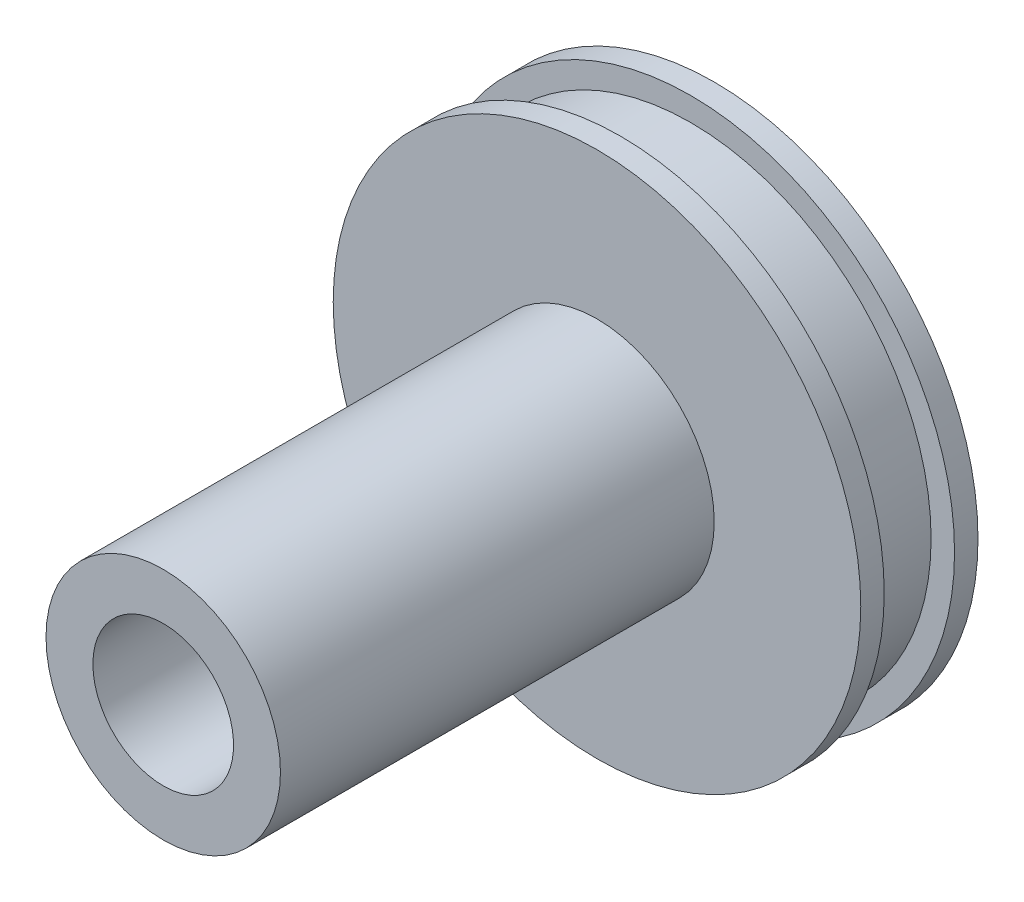
ISO-10303-21;
HEADER;
FILE_DESCRIPTION(('STEP AP214'),'2;1');
FILE_NAME('part.step','',(''),(''),'','','');
FILE_SCHEMA(('AUTOMOTIVE_DESIGN { 1 0 10303 214 1 1 1 1 }'));
ENDSEC;
DATA;
#1=APPLICATION_CONTEXT('core data for automotive mechanical design processes');
#2=APPLICATION_PROTOCOL_DEFINITION('international standard','automotive_design',2000,#1);
#3=PRODUCT_CONTEXT('',#1,'mechanical');
#4=PRODUCT('Part','Part','',(#3));
#5=PRODUCT_RELATED_PRODUCT_CATEGORY('part','',(#4));
#6=PRODUCT_DEFINITION_FORMATION('','',#4);
#7=PRODUCT_DEFINITION_CONTEXT('part definition',#1,'design');
#8=PRODUCT_DEFINITION('design','',#6,#7);
#9=PRODUCT_DEFINITION_SHAPE('','',#8);
#10=(LENGTH_UNIT() NAMED_UNIT(*) SI_UNIT(.MILLI.,.METRE.));
#11=(NAMED_UNIT(*) PLANE_ANGLE_UNIT() SI_UNIT($,.RADIAN.));
#12=(NAMED_UNIT(*) SI_UNIT($,.STERADIAN.) SOLID_ANGLE_UNIT());
#13=UNCERTAINTY_MEASURE_WITH_UNIT(LENGTH_MEASURE(1.E-05),#10,'distance_accuracy_value','');
#14=(GEOMETRIC_REPRESENTATION_CONTEXT(3) GLOBAL_UNCERTAINTY_ASSIGNED_CONTEXT((#13)) GLOBAL_UNIT_ASSIGNED_CONTEXT((#10,
#11,#12)) REPRESENTATION_CONTEXT('',''));
#15=CARTESIAN_POINT('',(0.,0.,0.));
#16=DIRECTION('',(0.,0.,1.));
#17=DIRECTION('',(1.,0.,0.));
#18=AXIS2_PLACEMENT_3D('',#15,#16,#17);
#19=CARTESIAN_POINT('',(0.,0.,47.));
#20=DIRECTION('',(0.,0.,1.));
#21=DIRECTION('',(1.,0.,0.));
#22=AXIS2_PLACEMENT_3D('',#19,#20,#21);
#23=PLANE('',#22);
#24=CARTESIAN_POINT('',(0.,0.,47.));
#25=DIRECTION('',(0.,0.,1.));
#26=DIRECTION('',(1.,0.,0.));
#27=AXIS2_PLACEMENT_3D('',#24,#25,#26);
#28=CIRCLE('',#27,10.);
#29=CARTESIAN_POINT('',(10.,0.,47.));
#30=VERTEX_POINT('',#29);
#31=EDGE_CURVE('E55',#30,#30,#28,.T.);
#32=ORIENTED_EDGE('',*,*,#31,.T.);
#33=EDGE_LOOP('',(#32));
#34=FACE_BOUND('',#33,.T.);
#35=CARTESIAN_POINT('',(0.,0.,47.));
#36=DIRECTION('',(0.,0.,-1.));
#37=DIRECTION('',(-1.,0.,0.));
#38=AXIS2_PLACEMENT_3D('',#35,#36,#37);
#39=CIRCLE('',#38,5.99999999999999);
#40=CARTESIAN_POINT('',(-5.99999999999999,0.,47.));
#41=VERTEX_POINT('',#40);
#42=EDGE_CURVE('E61',#41,#41,#39,.T.);
#43=ORIENTED_EDGE('',*,*,#42,.T.);
#44=EDGE_LOOP('',(#43));
#45=FACE_BOUND('',#44,.T.);
#46=ADVANCED_FACE('F33',(#34,#45),#23,.T.);
#47=CARTESIAN_POINT('',(0.,0.,2.));
#48=DIRECTION('',(0.,0.,-1.));
#49=DIRECTION('',(-1.,0.,0.));
#50=AXIS2_PLACEMENT_3D('',#47,#48,#49);
#51=CYLINDRICAL_SURFACE('',#50,22.5);
#52=CARTESIAN_POINT('',(0.,0.,2.));
#53=DIRECTION('',(0.,0.,1.));
#54=DIRECTION('',(1.,0.,0.));
#55=AXIS2_PLACEMENT_3D('',#52,#53,#54);
#56=CIRCLE('',#55,22.5);
#57=CARTESIAN_POINT('',(22.5,0.,2.));
#58=VERTEX_POINT('',#57);
#59=EDGE_CURVE('E10',#58,#58,#56,.T.);
#60=ORIENTED_EDGE('',*,*,#59,.F.);
#61=EDGE_LOOP('',(#60));
#62=FACE_BOUND('',#61,.T.);
#63=CARTESIAN_POINT('',(0.,0.,0.));
#64=DIRECTION('',(0.,0.,1.));
#65=DIRECTION('',(1.,0.,0.));
#66=AXIS2_PLACEMENT_3D('',#63,#64,#65);
#67=CIRCLE('',#66,22.5);
#68=CARTESIAN_POINT('',(22.5,0.,0.));
#69=VERTEX_POINT('',#68);
#70=EDGE_CURVE('E37',#69,#69,#67,.T.);
#71=ORIENTED_EDGE('',*,*,#70,.T.);
#72=EDGE_LOOP('',(#71));
#73=FACE_BOUND('',#72,.T.);
#74=ADVANCED_FACE('F35',(#62,#73),#51,.T.);
#75=CARTESIAN_POINT('',(0.,0.,2.));
#76=DIRECTION('',(0.,0.,1.));
#77=DIRECTION('',(1.,0.,0.));
#78=AXIS2_PLACEMENT_3D('',#75,#76,#77);
#79=PLANE('',#78);
#80=CARTESIAN_POINT('',(0.,0.,2.));
#81=DIRECTION('',(0.,0.,1.));
#82=DIRECTION('',(1.,0.,0.));
#83=AXIS2_PLACEMENT_3D('',#80,#81,#82);
#84=CIRCLE('',#83,20.5);
#85=CARTESIAN_POINT('',(20.5,0.,2.));
#86=VERTEX_POINT('',#85);
#87=EDGE_CURVE('E44',#86,#86,#84,.F.);
#88=ORIENTED_EDGE('',*,*,#87,.T.);
#89=EDGE_LOOP('',(#88));
#90=FACE_BOUND('',#89,.T.);
#91=ORIENTED_EDGE('',*,*,#59,.T.);
#92=EDGE_LOOP('',(#91));
#93=FACE_BOUND('',#92,.T.);
#94=ADVANCED_FACE('F76',(#90,#93),#79,.T.);
#95=CARTESIAN_POINT('',(0.,0.,0.));
#96=DIRECTION('',(0.,0.,1.));
#97=DIRECTION('',(1.,0.,0.));
#98=AXIS2_PLACEMENT_3D('',#95,#96,#97);
#99=PLANE('',#98);
#100=CARTESIAN_POINT('',(0.,0.,0.));
#101=DIRECTION('',(0.,0.,-1.));
#102=DIRECTION('',(-1.,0.,0.));
#103=AXIS2_PLACEMENT_3D('',#100,#101,#102);
#104=CIRCLE('',#103,5.99999999999999);
#105=CARTESIAN_POINT('',(-5.99999999999999,0.,0.));
#106=VERTEX_POINT('',#105);
#107=EDGE_CURVE('E66',#106,#106,#104,.T.);
#108=ORIENTED_EDGE('',*,*,#107,.F.);
#109=EDGE_LOOP('',(#108));
#110=FACE_BOUND('',#109,.T.);
#111=ORIENTED_EDGE('',*,*,#70,.F.);
#112=EDGE_LOOP('',(#111));
#113=FACE_BOUND('',#112,.T.);
#114=ADVANCED_FACE('F72',(#110,#113),#99,.F.);
#115=CARTESIAN_POINT('',(0.,0.,8.));
#116=DIRECTION('',(0.,0.,-1.));
#117=DIRECTION('',(-1.,0.,0.));
#118=AXIS2_PLACEMENT_3D('',#115,#116,#117);
#119=CYLINDRICAL_SURFACE('',#118,20.5);
#120=ORIENTED_EDGE('',*,*,#87,.F.);
#121=EDGE_LOOP('',(#120));
#122=FACE_BOUND('',#121,.T.);
#123=CARTESIAN_POINT('',(0.,0.,8.));
#124=DIRECTION('',(0.,0.,1.));
#125=DIRECTION('',(1.,0.,0.));
#126=AXIS2_PLACEMENT_3D('',#123,#124,#125);
#127=CIRCLE('',#126,20.5);
#128=CARTESIAN_POINT('',(20.5,0.,8.));
#129=VERTEX_POINT('',#128);
#130=EDGE_CURVE('E48',#129,#129,#127,.T.);
#131=ORIENTED_EDGE('',*,*,#130,.F.);
#132=EDGE_LOOP('',(#131));
#133=FACE_BOUND('',#132,.T.);
#134=ADVANCED_FACE('F75',(#122,#133),#119,.T.);
#135=CARTESIAN_POINT('',(0.,0.,10.));
#136=DIRECTION('',(0.,0.,-1.));
#137=DIRECTION('',(-1.,0.,0.));
#138=AXIS2_PLACEMENT_3D('',#135,#136,#137);
#139=CYLINDRICAL_SURFACE('',#138,22.5);
#140=CARTESIAN_POINT('',(0.,0.,10.));
#141=DIRECTION('',(0.,0.,1.));
#142=DIRECTION('',(1.,0.,0.));
#143=AXIS2_PLACEMENT_3D('',#140,#141,#142);
#144=CIRCLE('',#143,22.5);
#145=CARTESIAN_POINT('',(22.5,0.,10.));
#146=VERTEX_POINT('',#145);
#147=EDGE_CURVE('E51',#146,#146,#144,.T.);
#148=ORIENTED_EDGE('',*,*,#147,.F.);
#149=EDGE_LOOP('',(#148));
#150=FACE_BOUND('',#149,.T.);
#151=CARTESIAN_POINT('',(0.,0.,8.));
#152=DIRECTION('',(0.,0.,1.));
#153=DIRECTION('',(1.,0.,0.));
#154=AXIS2_PLACEMENT_3D('',#151,#152,#153);
#155=CIRCLE('',#154,22.5);
#156=CARTESIAN_POINT('',(22.5,0.,8.));
#157=VERTEX_POINT('',#156);
#158=EDGE_CURVE('E52',#157,#157,#155,.T.);
#159=ORIENTED_EDGE('',*,*,#158,.T.);
#160=EDGE_LOOP('',(#159));
#161=FACE_BOUND('',#160,.T.);
#162=ADVANCED_FACE('F102',(#150,#161),#139,.T.);
#163=CARTESIAN_POINT('',(0.,0.,10.));
#164=DIRECTION('',(0.,0.,1.));
#165=DIRECTION('',(1.,0.,0.));
#166=AXIS2_PLACEMENT_3D('',#163,#164,#165);
#167=PLANE('',#166);
#168=CARTESIAN_POINT('',(0.,0.,10.));
#169=DIRECTION('',(0.,0.,1.));
#170=DIRECTION('',(1.,0.,0.));
#171=AXIS2_PLACEMENT_3D('',#168,#169,#170);
#172=CIRCLE('',#171,10.);
#173=CARTESIAN_POINT('',(10.,0.,10.));
#174=VERTEX_POINT('',#173);
#175=EDGE_CURVE('E58',#174,#174,#172,.T.);
#176=ORIENTED_EDGE('',*,*,#175,.F.);
#177=EDGE_LOOP('',(#176));
#178=FACE_BOUND('',#177,.T.);
#179=ORIENTED_EDGE('',*,*,#147,.T.);
#180=EDGE_LOOP('',(#179));
#181=FACE_BOUND('',#180,.T.);
#182=ADVANCED_FACE('F99',(#178,#181),#167,.T.);
#183=CARTESIAN_POINT('',(0.,0.,8.));
#184=DIRECTION('',(0.,0.,1.));
#185=DIRECTION('',(1.,0.,0.));
#186=AXIS2_PLACEMENT_3D('',#183,#184,#185);
#187=PLANE('',#186);
#188=ORIENTED_EDGE('',*,*,#130,.T.);
#189=EDGE_LOOP('',(#188));
#190=FACE_BOUND('',#189,.T.);
#191=ORIENTED_EDGE('',*,*,#158,.F.);
#192=EDGE_LOOP('',(#191));
#193=FACE_BOUND('',#192,.T.);
#194=ADVANCED_FACE('F97',(#190,#193),#187,.F.);
#195=CARTESIAN_POINT('',(0.,0.,47.));
#196=DIRECTION('',(0.,0.,-1.));
#197=DIRECTION('',(-1.,0.,0.));
#198=AXIS2_PLACEMENT_3D('',#195,#196,#197);
#199=CYLINDRICAL_SURFACE('',#198,10.);
#200=ORIENTED_EDGE('',*,*,#31,.F.);
#201=EDGE_LOOP('',(#200));
#202=FACE_BOUND('',#201,.T.);
#203=ORIENTED_EDGE('',*,*,#175,.T.);
#204=EDGE_LOOP('',(#203));
#205=FACE_BOUND('',#204,.T.);
#206=ADVANCED_FACE('F94',(#202,#205),#199,.T.);
#207=CARTESIAN_POINT('',(0.,0.,0.));
#208=DIRECTION('',(0.,0.,-1.));
#209=DIRECTION('',(-1.,0.,0.));
#210=AXIS2_PLACEMENT_3D('',#207,#208,#209);
#211=CYLINDRICAL_SURFACE('',#210,5.99999999999999);
#212=ORIENTED_EDGE('',*,*,#42,.F.);
#213=EDGE_LOOP('',(#212));
#214=FACE_BOUND('',#213,.T.);
#215=ORIENTED_EDGE('',*,*,#107,.T.);
#216=EDGE_LOOP('',(#215));
#217=FACE_BOUND('',#216,.T.);
#218=ADVANCED_FACE('F70',(#214,#217),#211,.F.);
#219=CLOSED_SHELL('',(#46,#74,#94,#114,#134,#162,#182,#194,#206,#218));
#220=MANIFOLD_SOLID_BREP('B2',#219);
#221=ADVANCED_BREP_SHAPE_REPRESENTATION('',(#18,#220),#14);
#222=SHAPE_DEFINITION_REPRESENTATION(#9,#221);
ENDSEC;
END-ISO-10303-21;
